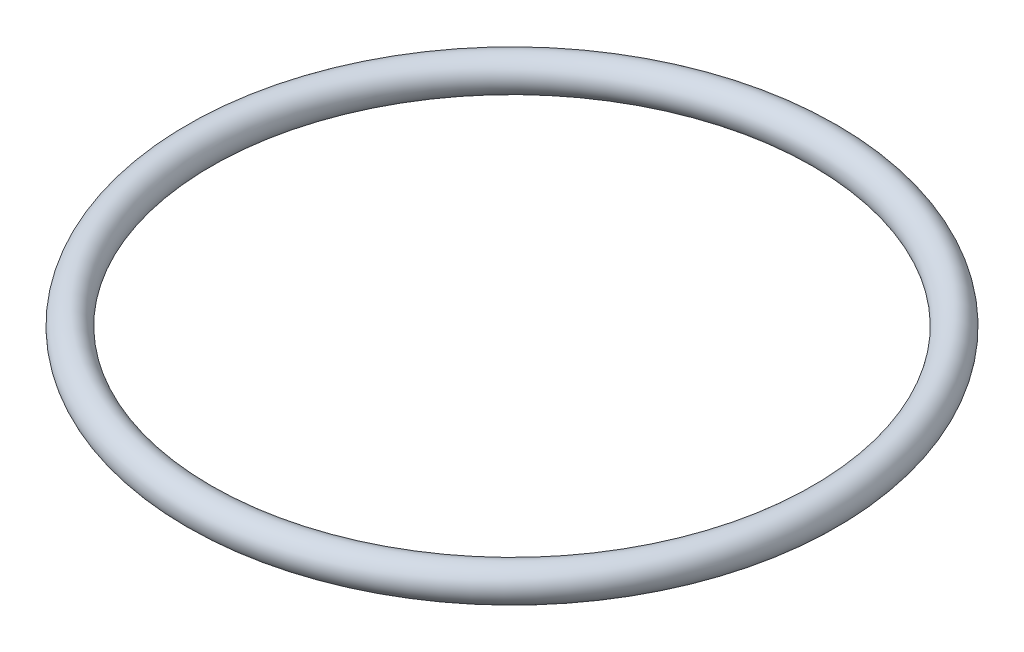
ISO-10303-21;
HEADER;
FILE_DESCRIPTION(('STEP AP214'),'2;1');
FILE_NAME('part.step','',(''),(''),'','','');
FILE_SCHEMA(('AUTOMOTIVE_DESIGN { 1 0 10303 214 1 1 1 1 }'));
ENDSEC;
DATA;
#1=APPLICATION_CONTEXT('core data for automotive mechanical design processes');
#2=APPLICATION_PROTOCOL_DEFINITION('international standard','automotive_design',2000,#1);
#3=PRODUCT_CONTEXT('',#1,'mechanical');
#4=PRODUCT('Part','Part','',(#3));
#5=PRODUCT_RELATED_PRODUCT_CATEGORY('part','',(#4));
#6=PRODUCT_DEFINITION_FORMATION('','',#4);
#7=PRODUCT_DEFINITION_CONTEXT('part definition',#1,'design');
#8=PRODUCT_DEFINITION('design','',#6,#7);
#9=PRODUCT_DEFINITION_SHAPE('','',#8);
#10=(LENGTH_UNIT() NAMED_UNIT(*) SI_UNIT(.MILLI.,.METRE.));
#11=(NAMED_UNIT(*) PLANE_ANGLE_UNIT() SI_UNIT($,.RADIAN.));
#12=(NAMED_UNIT(*) SI_UNIT($,.STERADIAN.) SOLID_ANGLE_UNIT());
#13=UNCERTAINTY_MEASURE_WITH_UNIT(LENGTH_MEASURE(1.E-05),#10,'distance_accuracy_value','');
#14=(GEOMETRIC_REPRESENTATION_CONTEXT(3) GLOBAL_UNCERTAINTY_ASSIGNED_CONTEXT((#13)) GLOBAL_UNIT_ASSIGNED_CONTEXT((#10,
#11,#12)) REPRESENTATION_CONTEXT('',''));
#15=CARTESIAN_POINT('',(0.,0.,0.));
#16=DIRECTION('',(0.,0.,1.));
#17=DIRECTION('',(1.,0.,0.));
#18=AXIS2_PLACEMENT_3D('',#15,#16,#17);
#19=CARTESIAN_POINT('',(0.,0.,0.));
#20=DIRECTION('',(0.,1.,0.));
#21=DIRECTION('',(0.,0.,1.));
#22=AXIS2_PLACEMENT_3D('',#19,#20,#21);
#23=TOROIDAL_SURFACE('',#22,185.,10.);
#24=CARTESIAN_POINT('',(0.,0.,195.));
#25=VERTEX_POINT('',#24);
#26=VERTEX_LOOP('',#25);
#27=FACE_BOUND('',#26,.T.);
#28=ADVANCED_FACE('F28',(#27),#23,.T.);
#29=CLOSED_SHELL('',(#28));
#30=MANIFOLD_SOLID_BREP('B2',#29);
#31=ADVANCED_BREP_SHAPE_REPRESENTATION('',(#18,#30),#14);
#32=SHAPE_DEFINITION_REPRESENTATION(#9,#31);
ENDSEC;
END-ISO-10303-21;
